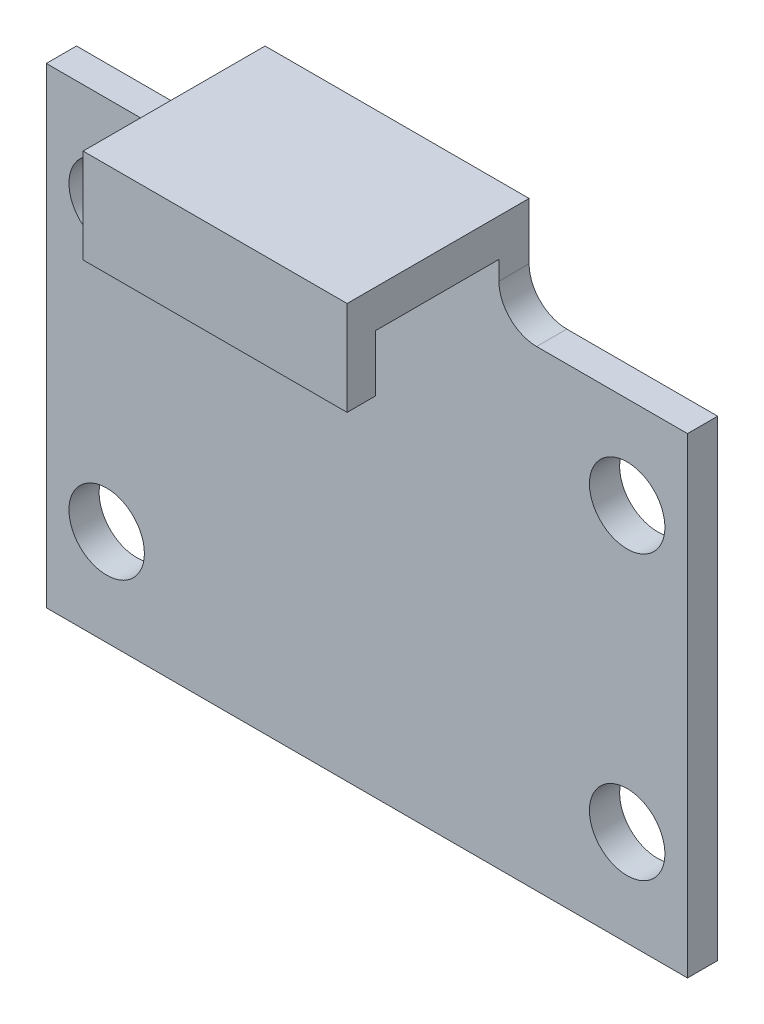
ISO-10303-21;
HEADER;
FILE_DESCRIPTION(('STEP AP214'),'2;1');
FILE_NAME('part.step','',(''),(''),'','','');
FILE_SCHEMA(('AUTOMOTIVE_DESIGN { 1 0 10303 214 1 1 1 1 }'));
ENDSEC;
DATA;
#1=APPLICATION_CONTEXT('core data for automotive mechanical design processes');
#2=APPLICATION_PROTOCOL_DEFINITION('international standard','automotive_design',2000,#1);
#3=PRODUCT_CONTEXT('',#1,'mechanical');
#4=PRODUCT('Part','Part','',(#3));
#5=PRODUCT_RELATED_PRODUCT_CATEGORY('part','',(#4));
#6=PRODUCT_DEFINITION_FORMATION('','',#4);
#7=PRODUCT_DEFINITION_CONTEXT('part definition',#1,'design');
#8=PRODUCT_DEFINITION('design','',#6,#7);
#9=PRODUCT_DEFINITION_SHAPE('','',#8);
#10=(LENGTH_UNIT() NAMED_UNIT(*) SI_UNIT(.MILLI.,.METRE.));
#11=(NAMED_UNIT(*) PLANE_ANGLE_UNIT() SI_UNIT($,.RADIAN.));
#12=(NAMED_UNIT(*) SI_UNIT($,.STERADIAN.) SOLID_ANGLE_UNIT());
#13=UNCERTAINTY_MEASURE_WITH_UNIT(LENGTH_MEASURE(1.E-05),#10,'distance_accuracy_value','');
#14=(GEOMETRIC_REPRESENTATION_CONTEXT(3) GLOBAL_UNCERTAINTY_ASSIGNED_CONTEXT((#13)) GLOBAL_UNIT_ASSIGNED_CONTEXT((#10,
#11,#12)) REPRESENTATION_CONTEXT('',''));
#15=CARTESIAN_POINT('',(0.,0.,0.));
#16=DIRECTION('',(0.,0.,1.));
#17=DIRECTION('',(1.,0.,0.));
#18=AXIS2_PLACEMENT_3D('',#15,#16,#17);
#19=CARTESIAN_POINT('',(-21.59,25.4,2.032));
#20=DIRECTION('',(0.,-1.,0.));
#21=DIRECTION('',(0.,0.,-1.));
#22=AXIS2_PLACEMENT_3D('',#19,#20,#21);
#23=PLANE('',#22);
#24=DIRECTION('',(0.,0.,-1.));
#25=VECTOR('',#24,1.);
#26=CARTESIAN_POINT('',(-8.89000000000001,25.4,0.));
#27=LINE('',#26,#25);
#28=CARTESIAN_POINT('',(-8.89000000000001,25.4,12.2555));
#29=VERTEX_POINT('',#28);
#30=CARTESIAN_POINT('',(-8.89000000000001,25.4,0.));
#31=VERTEX_POINT('',#30);
#32=EDGE_CURVE('E203',#29,#31,#27,.T.);
#33=ORIENTED_EDGE('',*,*,#32,.F.);
#34=DIRECTION('',(-1.,0.,0.));
#35=VECTOR('',#34,1.);
#36=CARTESIAN_POINT('',(-21.59,25.4,12.2555));
#37=LINE('',#36,#35);
#38=CARTESIAN_POINT('',(8.88999999999998,25.4,12.2555));
#39=VERTEX_POINT('',#38);
#40=EDGE_CURVE('E245',#39,#29,#37,.T.);
#41=ORIENTED_EDGE('',*,*,#40,.F.);
#42=DIRECTION('',(0.,0.,1.));
#43=VECTOR('',#42,1.);
#44=CARTESIAN_POINT('',(8.88999999999998,25.4,0.));
#45=LINE('',#44,#43);
#46=CARTESIAN_POINT('',(8.88999999999998,25.4,0.));
#47=VERTEX_POINT('',#46);
#48=EDGE_CURVE('E220',#47,#39,#45,.T.);
#49=ORIENTED_EDGE('',*,*,#48,.F.);
#50=DIRECTION('',(-1.,0.,0.));
#51=VECTOR('',#50,1.);
#52=CARTESIAN_POINT('',(-21.59,25.4,0.));
#53=LINE('',#52,#51);
#54=EDGE_CURVE('E164',#47,#31,#53,.T.);
#55=ORIENTED_EDGE('',*,*,#54,.T.);
#56=EDGE_LOOP('',(#33,#41,#49,#55));
#57=FACE_BOUND('',#56,.T.);
#58=ADVANCED_FACE('F37',(#57),#23,.F.);
#59=CARTESIAN_POINT('',(-21.59,22.86,10.3505));
#60=DIRECTION('',(0.,1.,0.));
#61=DIRECTION('',(0.,0.,1.));
#62=AXIS2_PLACEMENT_3D('',#59,#60,#61);
#63=PLANE('',#62);
#64=DIRECTION('',(0.,0.,1.));
#65=VECTOR('',#64,1.);
#66=CARTESIAN_POINT('',(-8.89000000000001,22.86,10.3505));
#67=LINE('',#66,#65);
#68=CARTESIAN_POINT('',(-8.89000000000001,22.86,2.032));
#69=VERTEX_POINT('',#68);
#70=CARTESIAN_POINT('',(-8.89000000000001,22.86,10.3505));
#71=VERTEX_POINT('',#70);
#72=EDGE_CURVE('E215',#69,#71,#67,.T.);
#73=ORIENTED_EDGE('',*,*,#72,.F.);
#74=DIRECTION('',(1.,0.,0.));
#75=VECTOR('',#74,1.);
#76=CARTESIAN_POINT('',(-21.59,22.86,2.032));
#77=LINE('',#76,#75);
#78=CARTESIAN_POINT('',(8.88999999999998,22.86,2.032));
#79=VERTEX_POINT('',#78);
#80=EDGE_CURVE('E248',#69,#79,#77,.T.);
#81=ORIENTED_EDGE('',*,*,#80,.T.);
#82=DIRECTION('',(0.,0.,1.));
#83=VECTOR('',#82,1.);
#84=CARTESIAN_POINT('',(8.88999999999998,22.86,10.3505));
#85=LINE('',#84,#83);
#86=CARTESIAN_POINT('',(8.88999999999998,22.86,10.3505));
#87=VERTEX_POINT('',#86);
#88=EDGE_CURVE('E234',#79,#87,#85,.T.);
#89=ORIENTED_EDGE('',*,*,#88,.T.);
#90=DIRECTION('',(1.,0.,0.));
#91=VECTOR('',#90,1.);
#92=CARTESIAN_POINT('',(-21.59,22.86,10.3505));
#93=LINE('',#92,#91);
#94=EDGE_CURVE('E250',#71,#87,#93,.T.);
#95=ORIENTED_EDGE('',*,*,#94,.F.);
#96=EDGE_LOOP('',(#73,#81,#89,#95));
#97=FACE_BOUND('',#96,.T.);
#98=ADVANCED_FACE('F291',(#97),#63,.F.);
#99=CARTESIAN_POINT('',(0.,0.,10.3505));
#100=DIRECTION('',(0.,0.,1.));
#101=DIRECTION('',(1.,0.,0.));
#102=AXIS2_PLACEMENT_3D('',#99,#100,#101);
#103=PLANE('',#102);
#104=DIRECTION('',(0.,-1.,0.));
#105=VECTOR('',#104,1.);
#106=CARTESIAN_POINT('',(-8.89000000000001,0.,10.3505));
#107=LINE('',#106,#105);
#108=CARTESIAN_POINT('',(-8.89000000000001,19.05,10.3505));
#109=VERTEX_POINT('',#108);
#110=EDGE_CURVE('E323',#71,#109,#107,.T.);
#111=ORIENTED_EDGE('',*,*,#110,.F.);
#112=ORIENTED_EDGE('',*,*,#94,.T.);
#113=DIRECTION('',(0.,-1.,0.));
#114=VECTOR('',#113,1.);
#115=CARTESIAN_POINT('',(8.88999999999998,0.,10.3505));
#116=LINE('',#115,#114);
#117=CARTESIAN_POINT('',(8.88999999999998,19.05,10.3505));
#118=VERTEX_POINT('',#117);
#119=EDGE_CURVE('E231',#87,#118,#116,.T.);
#120=ORIENTED_EDGE('',*,*,#119,.T.);
#121=DIRECTION('',(1.,0.,0.));
#122=VECTOR('',#121,1.);
#123=CARTESIAN_POINT('',(-21.59,19.05,10.3505));
#124=LINE('',#123,#122);
#125=EDGE_CURVE('E242',#109,#118,#124,.T.);
#126=ORIENTED_EDGE('',*,*,#125,.F.);
#127=EDGE_LOOP('',(#111,#112,#120,#126));
#128=FACE_BOUND('',#127,.T.);
#129=ADVANCED_FACE('F297',(#128),#103,.F.);
#130=CARTESIAN_POINT('',(-21.59,19.05,12.2555));
#131=DIRECTION('',(0.,1.,0.));
#132=DIRECTION('',(0.,0.,1.));
#133=AXIS2_PLACEMENT_3D('',#130,#131,#132);
#134=PLANE('',#133);
#135=DIRECTION('',(0.,0.,1.));
#136=VECTOR('',#135,1.);
#137=CARTESIAN_POINT('',(-8.89000000000001,19.05,0.));
#138=LINE('',#137,#136);
#139=CARTESIAN_POINT('',(-8.89000000000001,19.05,12.2555));
#140=VERTEX_POINT('',#139);
#141=EDGE_CURVE('E204',#109,#140,#138,.T.);
#142=ORIENTED_EDGE('',*,*,#141,.F.);
#143=ORIENTED_EDGE('',*,*,#125,.T.);
#144=DIRECTION('',(0.,0.,-1.));
#145=VECTOR('',#144,1.);
#146=CARTESIAN_POINT('',(8.88999999999998,19.05,0.));
#147=LINE('',#146,#145);
#148=CARTESIAN_POINT('',(8.88999999999998,19.05,12.2555));
#149=VERTEX_POINT('',#148);
#150=EDGE_CURVE('E225',#149,#118,#147,.T.);
#151=ORIENTED_EDGE('',*,*,#150,.F.);
#152=DIRECTION('',(1.,0.,0.));
#153=VECTOR('',#152,1.);
#154=CARTESIAN_POINT('',(-21.59,19.05,12.2555));
#155=LINE('',#154,#153);
#156=EDGE_CURVE('E243',#140,#149,#155,.T.);
#157=ORIENTED_EDGE('',*,*,#156,.F.);
#158=EDGE_LOOP('',(#142,#143,#151,#157));
#159=FACE_BOUND('',#158,.T.);
#160=ADVANCED_FACE('F350',(#159),#134,.F.);
#161=CARTESIAN_POINT('',(0.,0.,12.2555));
#162=DIRECTION('',(0.,0.,1.));
#163=DIRECTION('',(1.,0.,0.));
#164=AXIS2_PLACEMENT_3D('',#161,#162,#163);
#165=PLANE('',#164);
#166=ORIENTED_EDGE('',*,*,#40,.T.);
#167=DIRECTION('',(0.,1.,0.));
#168=VECTOR('',#167,1.);
#169=CARTESIAN_POINT('',(-8.89000000000001,25.4,12.2555));
#170=LINE('',#169,#168);
#171=EDGE_CURVE('E329',#140,#29,#170,.T.);
#172=ORIENTED_EDGE('',*,*,#171,.F.);
#173=ORIENTED_EDGE('',*,*,#156,.T.);
#174=DIRECTION('',(0.,-1.,0.));
#175=VECTOR('',#174,1.);
#176=CARTESIAN_POINT('',(8.88999999999998,25.4,12.2555));
#177=LINE('',#176,#175);
#178=EDGE_CURVE('E222',#39,#149,#177,.T.);
#179=ORIENTED_EDGE('',*,*,#178,.F.);
#180=EDGE_LOOP('',(#166,#172,#173,#179));
#181=FACE_BOUND('',#180,.T.);
#182=ADVANCED_FACE('F302',(#181),#165,.T.);
#183=CARTESIAN_POINT('',(21.59,25.4,2.032));
#184=DIRECTION('',(-1.,0.,0.));
#185=DIRECTION('',(0.,-1.,0.));
#186=AXIS2_PLACEMENT_3D('',#183,#184,#185);
#187=PLANE('',#186);
#188=DIRECTION('',(0.,1.,0.));
#189=VECTOR('',#188,1.);
#190=CARTESIAN_POINT('',(21.59,25.4,2.032));
#191=LINE('',#190,#189);
#192=CARTESIAN_POINT('',(21.59,-12.7,2.032));
#193=VERTEX_POINT('',#192);
#194=CARTESIAN_POINT('',(21.59,19.05,2.032));
#195=VERTEX_POINT('',#194);
#196=EDGE_CURVE('E149',#193,#195,#191,.T.);
#197=ORIENTED_EDGE('',*,*,#196,.F.);
#198=DIRECTION('',(0.,0.,1.));
#199=VECTOR('',#198,1.);
#200=CARTESIAN_POINT('',(21.59,-12.7,-10.668));
#201=LINE('',#200,#199);
#202=CARTESIAN_POINT('',(21.59,-12.7,0.));
#203=VERTEX_POINT('',#202);
#204=EDGE_CURVE('E136',#203,#193,#201,.T.);
#205=ORIENTED_EDGE('',*,*,#204,.F.);
#206=DIRECTION('',(0.,1.,0.));
#207=VECTOR('',#206,1.);
#208=CARTESIAN_POINT('',(21.59,25.4,0.));
#209=LINE('',#208,#207);
#210=CARTESIAN_POINT('',(21.59,19.05,0.));
#211=VERTEX_POINT('',#210);
#212=EDGE_CURVE('E170',#203,#211,#209,.T.);
#213=ORIENTED_EDGE('',*,*,#212,.T.);
#214=DIRECTION('',(0.,0.,-1.));
#215=VECTOR('',#214,1.);
#216=CARTESIAN_POINT('',(21.59,19.05,0.));
#217=LINE('',#216,#215);
#218=EDGE_CURVE('E158',#195,#211,#217,.T.);
#219=ORIENTED_EDGE('',*,*,#218,.F.);
#220=EDGE_LOOP('',(#197,#205,#213,#219));
#221=FACE_BOUND('',#220,.T.);
#222=ADVANCED_FACE('F156',(#221),#187,.F.);
#223=CARTESIAN_POINT('',(-21.59,25.4,2.032));
#224=DIRECTION('',(1.,0.,0.));
#225=DIRECTION('',(0.,1.,0.));
#226=AXIS2_PLACEMENT_3D('',#223,#224,#225);
#227=PLANE('',#226);
#228=DIRECTION('',(0.,-1.,0.));
#229=VECTOR('',#228,1.);
#230=CARTESIAN_POINT('',(-21.59,25.4,0.));
#231=LINE('',#230,#229);
#232=CARTESIAN_POINT('',(-21.59,19.05,0.));
#233=VERTEX_POINT('',#232);
#234=CARTESIAN_POINT('',(-21.59,-12.7,0.));
#235=VERTEX_POINT('',#234);
#236=EDGE_CURVE('E159',#233,#235,#231,.T.);
#237=ORIENTED_EDGE('',*,*,#236,.T.);
#238=DIRECTION('',(0.,0.,1.));
#239=VECTOR('',#238,1.);
#240=CARTESIAN_POINT('',(-21.59,-12.7,-10.668));
#241=LINE('',#240,#239);
#242=CARTESIAN_POINT('',(-21.59,-12.7,2.032));
#243=VERTEX_POINT('',#242);
#244=EDGE_CURVE('E52',#235,#243,#241,.T.);
#245=ORIENTED_EDGE('',*,*,#244,.T.);
#246=DIRECTION('',(0.,-1.,0.));
#247=VECTOR('',#246,1.);
#248=CARTESIAN_POINT('',(-21.59,25.4,2.032));
#249=LINE('',#248,#247);
#250=CARTESIAN_POINT('',(-21.59,19.05,2.032));
#251=VERTEX_POINT('',#250);
#252=EDGE_CURVE('E153',#251,#243,#249,.T.);
#253=ORIENTED_EDGE('',*,*,#252,.F.);
#254=DIRECTION('',(0.,0.,1.));
#255=VECTOR('',#254,1.);
#256=CARTESIAN_POINT('',(-21.59,19.05,0.));
#257=LINE('',#256,#255);
#258=EDGE_CURVE('E205',#233,#251,#257,.T.);
#259=ORIENTED_EDGE('',*,*,#258,.F.);
#260=EDGE_LOOP('',(#237,#245,#253,#259));
#261=FACE_BOUND('',#260,.T.);
#262=ADVANCED_FACE('F279',(#261),#227,.F.);
#263=CARTESIAN_POINT('',(0.,0.,2.032));
#264=DIRECTION('',(0.,0.,1.));
#265=DIRECTION('',(1.,0.,0.));
#266=AXIS2_PLACEMENT_3D('',#263,#264,#265);
#267=PLANE('',#266);
#268=DIRECTION('',(-1.,0.,0.));
#269=VECTOR('',#268,1.);
#270=CARTESIAN_POINT('',(-21.59,-12.7,2.032));
#271=LINE('',#270,#269);
#272=EDGE_CURVE('E139',#193,#243,#271,.T.);
#273=ORIENTED_EDGE('',*,*,#272,.F.);
#274=ORIENTED_EDGE('',*,*,#196,.T.);
#275=DIRECTION('',(1.,0.,0.));
#276=VECTOR('',#275,1.);
#277=CARTESIAN_POINT('',(0.,19.05,2.032));
#278=LINE('',#277,#276);
#279=CARTESIAN_POINT('',(11.43,19.05,2.032));
#280=VERTEX_POINT('',#279);
#281=EDGE_CURVE('E240',#280,#195,#278,.T.);
#282=ORIENTED_EDGE('',*,*,#281,.F.);
#283=CARTESIAN_POINT('',(11.43,21.59,2.032));
#284=DIRECTION('',(0.,0.,1.));
#285=DIRECTION('',(1.,0.,0.));
#286=AXIS2_PLACEMENT_3D('',#283,#284,#285);
#287=CIRCLE('',#286,2.54);
#288=CARTESIAN_POINT('',(8.88999999999998,21.59,2.032));
#289=VERTEX_POINT('',#288);
#290=EDGE_CURVE('E185',#280,#289,#287,.F.);
#291=ORIENTED_EDGE('',*,*,#290,.T.);
#292=DIRECTION('',(0.,-1.,0.));
#293=VECTOR('',#292,1.);
#294=CARTESIAN_POINT('',(8.88999999999998,0.,2.032));
#295=LINE('',#294,#293);
#296=EDGE_CURVE('E237',#79,#289,#295,.T.);
#297=ORIENTED_EDGE('',*,*,#296,.F.);
#298=ORIENTED_EDGE('',*,*,#80,.F.);
#299=DIRECTION('',(0.,-1.,0.));
#300=VECTOR('',#299,1.);
#301=CARTESIAN_POINT('',(-8.89000000000001,0.,2.032));
#302=LINE('',#301,#300);
#303=CARTESIAN_POINT('',(-8.89000000000001,21.59,2.032));
#304=VERTEX_POINT('',#303);
#305=EDGE_CURVE('E209',#69,#304,#302,.T.);
#306=ORIENTED_EDGE('',*,*,#305,.T.);
#307=CARTESIAN_POINT('',(-11.43,21.59,2.032));
#308=DIRECTION('',(0.,0.,1.));
#309=DIRECTION('',(1.,0.,0.));
#310=AXIS2_PLACEMENT_3D('',#307,#308,#309);
#311=CIRCLE('',#310,2.54);
#312=CARTESIAN_POINT('',(-11.43,19.05,2.032));
#313=VERTEX_POINT('',#312);
#314=EDGE_CURVE('E187',#304,#313,#311,.F.);
#315=ORIENTED_EDGE('',*,*,#314,.T.);
#316=DIRECTION('',(1.,0.,0.));
#317=VECTOR('',#316,1.);
#318=CARTESIAN_POINT('',(0.,19.05,2.032));
#319=LINE('',#318,#317);
#320=EDGE_CURVE('E207',#251,#313,#319,.T.);
#321=ORIENTED_EDGE('',*,*,#320,.F.);
#322=ORIENTED_EDGE('',*,*,#252,.T.);
#323=EDGE_LOOP('',(#273,#274,#282,#291,#297,#298,#306,#315,#321,#322));
#324=FACE_BOUND('',#323,.T.);
#325=CARTESIAN_POINT('',(17.526,12.827,2.032));
#326=DIRECTION('',(0.,0.,1.));
#327=DIRECTION('',(-1.,0.,0.));
#328=AXIS2_PLACEMENT_3D('',#325,#326,#327);
#329=CIRCLE('',#328,2.54);
#330=CARTESIAN_POINT('',(14.986,12.827,2.032));
#331=VERTEX_POINT('',#330);
#332=EDGE_CURVE('E266',#331,#331,#329,.T.);
#333=ORIENTED_EDGE('',*,*,#332,.F.);
#334=EDGE_LOOP('',(#333));
#335=FACE_BOUND('',#334,.T.);
#336=CARTESIAN_POINT('',(17.526,-6.22299999999999,2.032));
#337=DIRECTION('',(0.,0.,1.));
#338=DIRECTION('',(-1.,0.,0.));
#339=AXIS2_PLACEMENT_3D('',#336,#337,#338);
#340=CIRCLE('',#339,2.54);
#341=CARTESIAN_POINT('',(14.986,-6.22299999999999,2.032));
#342=VERTEX_POINT('',#341);
#343=EDGE_CURVE('E260',#342,#342,#340,.T.);
#344=ORIENTED_EDGE('',*,*,#343,.F.);
#345=EDGE_LOOP('',(#344));
#346=FACE_BOUND('',#345,.T.);
#347=CARTESIAN_POINT('',(-17.526,-6.223,2.032));
#348=DIRECTION('',(0.,0.,1.));
#349=DIRECTION('',(1.,0.,0.));
#350=AXIS2_PLACEMENT_3D('',#347,#348,#349);
#351=CIRCLE('',#350,2.54);
#352=CARTESIAN_POINT('',(-14.986,-6.223,2.032));
#353=VERTEX_POINT('',#352);
#354=EDGE_CURVE('E254',#353,#353,#351,.T.);
#355=ORIENTED_EDGE('',*,*,#354,.F.);
#356=EDGE_LOOP('',(#355));
#357=FACE_BOUND('',#356,.T.);
#358=CARTESIAN_POINT('',(-17.526,12.827,2.032));
#359=DIRECTION('',(0.,0.,1.));
#360=DIRECTION('',(1.,0.,0.));
#361=AXIS2_PLACEMENT_3D('',#358,#359,#360);
#362=CIRCLE('',#361,2.54);
#363=CARTESIAN_POINT('',(-14.986,12.827,2.032));
#364=VERTEX_POINT('',#363);
#365=EDGE_CURVE('E167',#364,#364,#362,.T.);
#366=ORIENTED_EDGE('',*,*,#365,.F.);
#367=EDGE_LOOP('',(#366));
#368=FACE_BOUND('',#367,.T.);
#369=ADVANCED_FACE('F146',(#324,#335,#346,#357,#368),#267,.T.);
#370=CARTESIAN_POINT('',(0.,0.,0.));
#371=DIRECTION('',(0.,0.,1.));
#372=DIRECTION('',(1.,0.,0.));
#373=AXIS2_PLACEMENT_3D('',#370,#371,#372);
#374=PLANE('',#373);
#375=CARTESIAN_POINT('',(17.526,12.827,0.));
#376=DIRECTION('',(0.,0.,1.));
#377=DIRECTION('',(-1.,0.,0.));
#378=AXIS2_PLACEMENT_3D('',#375,#376,#377);
#379=CIRCLE('',#378,2.54);
#380=CARTESIAN_POINT('',(14.986,12.827,0.));
#381=VERTEX_POINT('',#380);
#382=EDGE_CURVE('E252',#381,#381,#379,.T.);
#383=ORIENTED_EDGE('',*,*,#382,.T.);
#384=EDGE_LOOP('',(#383));
#385=FACE_BOUND('',#384,.T.);
#386=CARTESIAN_POINT('',(17.526,-6.22299999999999,0.));
#387=DIRECTION('',(0.,0.,1.));
#388=DIRECTION('',(-1.,0.,0.));
#389=AXIS2_PLACEMENT_3D('',#386,#387,#388);
#390=CIRCLE('',#389,2.54);
#391=CARTESIAN_POINT('',(14.986,-6.22299999999999,0.));
#392=VERTEX_POINT('',#391);
#393=EDGE_CURVE('E263',#392,#392,#390,.T.);
#394=ORIENTED_EDGE('',*,*,#393,.T.);
#395=EDGE_LOOP('',(#394));
#396=FACE_BOUND('',#395,.T.);
#397=CARTESIAN_POINT('',(-17.526,-6.223,0.));
#398=DIRECTION('',(0.,0.,1.));
#399=DIRECTION('',(1.,0.,0.));
#400=AXIS2_PLACEMENT_3D('',#397,#398,#399);
#401=CIRCLE('',#400,2.54);
#402=CARTESIAN_POINT('',(-14.986,-6.223,0.));
#403=VERTEX_POINT('',#402);
#404=EDGE_CURVE('E257',#403,#403,#401,.T.);
#405=ORIENTED_EDGE('',*,*,#404,.T.);
#406=EDGE_LOOP('',(#405));
#407=FACE_BOUND('',#406,.T.);
#408=CARTESIAN_POINT('',(-17.526,12.827,0.));
#409=DIRECTION('',(0.,0.,1.));
#410=DIRECTION('',(1.,0.,0.));
#411=AXIS2_PLACEMENT_3D('',#408,#409,#410);
#412=CIRCLE('',#411,2.54);
#413=CARTESIAN_POINT('',(-14.986,12.827,0.));
#414=VERTEX_POINT('',#413);
#415=EDGE_CURVE('E172',#414,#414,#412,.T.);
#416=ORIENTED_EDGE('',*,*,#415,.T.);
#417=EDGE_LOOP('',(#416));
#418=FACE_BOUND('',#417,.T.);
#419=ORIENTED_EDGE('',*,*,#212,.F.);
#420=DIRECTION('',(-1.,0.,0.));
#421=VECTOR('',#420,1.);
#422=CARTESIAN_POINT('',(0.,-12.7,0.));
#423=LINE('',#422,#421);
#424=EDGE_CURVE('E11',#203,#235,#423,.T.);
#425=ORIENTED_EDGE('',*,*,#424,.T.);
#426=ORIENTED_EDGE('',*,*,#236,.F.);
#427=DIRECTION('',(-1.,0.,0.));
#428=VECTOR('',#427,1.);
#429=CARTESIAN_POINT('',(-8.89000000000001,19.05,0.));
#430=LINE('',#429,#428);
#431=CARTESIAN_POINT('',(-11.43,19.05,0.));
#432=VERTEX_POINT('',#431);
#433=EDGE_CURVE('E196',#432,#233,#430,.T.);
#434=ORIENTED_EDGE('',*,*,#433,.F.);
#435=CARTESIAN_POINT('',(-11.43,21.59,0.));
#436=DIRECTION('',(0.,0.,1.));
#437=DIRECTION('',(1.,0.,0.));
#438=AXIS2_PLACEMENT_3D('',#435,#436,#437);
#439=CIRCLE('',#438,2.54);
#440=CARTESIAN_POINT('',(-8.89000000000001,21.59,0.));
#441=VERTEX_POINT('',#440);
#442=EDGE_CURVE('E45',#432,#441,#439,.T.);
#443=ORIENTED_EDGE('',*,*,#442,.T.);
#444=DIRECTION('',(0.,-1.,0.));
#445=VECTOR('',#444,1.);
#446=CARTESIAN_POINT('',(-8.89000000000001,25.4,0.));
#447=LINE('',#446,#445);
#448=EDGE_CURVE('E194',#31,#441,#447,.T.);
#449=ORIENTED_EDGE('',*,*,#448,.F.);
#450=ORIENTED_EDGE('',*,*,#54,.F.);
#451=DIRECTION('',(0.,1.,0.));
#452=VECTOR('',#451,1.);
#453=CARTESIAN_POINT('',(8.88999999999998,25.4,0.));
#454=LINE('',#453,#452);
#455=CARTESIAN_POINT('',(8.88999999999998,21.59,0.));
#456=VERTEX_POINT('',#455);
#457=EDGE_CURVE('E213',#456,#47,#454,.T.);
#458=ORIENTED_EDGE('',*,*,#457,.F.);
#459=CARTESIAN_POINT('',(11.43,21.59,0.));
#460=DIRECTION('',(0.,0.,1.));
#461=DIRECTION('',(1.,0.,0.));
#462=AXIS2_PLACEMENT_3D('',#459,#460,#461);
#463=CIRCLE('',#462,2.54);
#464=CARTESIAN_POINT('',(11.43,19.05,0.));
#465=VERTEX_POINT('',#464);
#466=EDGE_CURVE('E183',#456,#465,#463,.T.);
#467=ORIENTED_EDGE('',*,*,#466,.T.);
#468=DIRECTION('',(1.,0.,0.));
#469=VECTOR('',#468,1.);
#470=CARTESIAN_POINT('',(8.88999999999998,19.05,0.));
#471=LINE('',#470,#469);
#472=EDGE_CURVE('E227',#465,#211,#471,.T.);
#473=ORIENTED_EDGE('',*,*,#472,.T.);
#474=EDGE_LOOP('',(#419,#425,#426,#434,#443,#449,#450,#458,#467,#473));
#475=FACE_BOUND('',#474,.T.);
#476=ADVANCED_FACE('F192',(#385,#396,#407,#418,#475),#374,.F.);
#477=CARTESIAN_POINT('',(-17.526,12.827,0.));
#478=DIRECTION('',(0.,0.,1.));
#479=DIRECTION('',(1.,0.,0.));
#480=AXIS2_PLACEMENT_3D('',#477,#478,#479);
#481=CYLINDRICAL_SURFACE('',#480,2.54);
#482=ORIENTED_EDGE('',*,*,#415,.F.);
#483=EDGE_LOOP('',(#482));
#484=FACE_BOUND('',#483,.T.);
#485=ORIENTED_EDGE('',*,*,#365,.T.);
#486=EDGE_LOOP('',(#485));
#487=FACE_BOUND('',#486,.T.);
#488=ADVANCED_FACE('F276',(#484,#487),#481,.F.);
#489=CARTESIAN_POINT('',(-17.526,-6.223,0.));
#490=DIRECTION('',(0.,0.,1.));
#491=DIRECTION('',(1.,0.,0.));
#492=AXIS2_PLACEMENT_3D('',#489,#490,#491);
#493=CYLINDRICAL_SURFACE('',#492,2.54);
#494=ORIENTED_EDGE('',*,*,#404,.F.);
#495=EDGE_LOOP('',(#494));
#496=FACE_BOUND('',#495,.T.);
#497=ORIENTED_EDGE('',*,*,#354,.T.);
#498=EDGE_LOOP('',(#497));
#499=FACE_BOUND('',#498,.T.);
#500=ADVANCED_FACE('F358',(#496,#499),#493,.F.);
#501=CARTESIAN_POINT('',(17.526,-6.22299999999999,0.));
#502=DIRECTION('',(0.,0.,1.));
#503=DIRECTION('',(1.,0.,0.));
#504=AXIS2_PLACEMENT_3D('',#501,#502,#503);
#505=CYLINDRICAL_SURFACE('',#504,2.54);
#506=ORIENTED_EDGE('',*,*,#393,.F.);
#507=EDGE_LOOP('',(#506));
#508=FACE_BOUND('',#507,.T.);
#509=ORIENTED_EDGE('',*,*,#343,.T.);
#510=EDGE_LOOP('',(#509));
#511=FACE_BOUND('',#510,.T.);
#512=ADVANCED_FACE('F343',(#508,#511),#505,.F.);
#513=CARTESIAN_POINT('',(17.526,12.827,0.));
#514=DIRECTION('',(0.,0.,1.));
#515=DIRECTION('',(1.,0.,0.));
#516=AXIS2_PLACEMENT_3D('',#513,#514,#515);
#517=CYLINDRICAL_SURFACE('',#516,2.54);
#518=ORIENTED_EDGE('',*,*,#382,.F.);
#519=EDGE_LOOP('',(#518));
#520=FACE_BOUND('',#519,.T.);
#521=ORIENTED_EDGE('',*,*,#332,.T.);
#522=EDGE_LOOP('',(#521));
#523=FACE_BOUND('',#522,.T.);
#524=ADVANCED_FACE('F336',(#520,#523),#517,.F.);
#525=CARTESIAN_POINT('',(8.88999999999998,19.05,0.));
#526=DIRECTION('',(0.,-1.,0.));
#527=DIRECTION('',(1.,0.,0.));
#528=AXIS2_PLACEMENT_3D('',#525,#526,#527);
#529=PLANE('',#528);
#530=ORIENTED_EDGE('',*,*,#472,.F.);
#531=DIRECTION('',(0.,0.,-1.));
#532=VECTOR('',#531,1.);
#533=CARTESIAN_POINT('',(11.43,19.05,2.032));
#534=LINE('',#533,#532);
#535=EDGE_CURVE('E177',#465,#280,#534,.F.);
#536=ORIENTED_EDGE('',*,*,#535,.T.);
#537=ORIENTED_EDGE('',*,*,#281,.T.);
#538=ORIENTED_EDGE('',*,*,#218,.T.);
#539=EDGE_LOOP('',(#530,#536,#537,#538));
#540=FACE_BOUND('',#539,.T.);
#541=ADVANCED_FACE('F334',(#540),#529,.F.);
#542=CARTESIAN_POINT('',(8.88999999999998,0.,0.));
#543=DIRECTION('',(-1.,0.,0.));
#544=DIRECTION('',(0.,0.,1.));
#545=AXIS2_PLACEMENT_3D('',#542,#543,#544);
#546=PLANE('',#545);
#547=ORIENTED_EDGE('',*,*,#296,.T.);
#548=DIRECTION('',(0.,0.,-1.));
#549=VECTOR('',#548,1.);
#550=CARTESIAN_POINT('',(8.88999999999998,21.59,0.));
#551=LINE('',#550,#549);
#552=EDGE_CURVE('E161',#289,#456,#551,.T.);
#553=ORIENTED_EDGE('',*,*,#552,.T.);
#554=ORIENTED_EDGE('',*,*,#457,.T.);
#555=ORIENTED_EDGE('',*,*,#48,.T.);
#556=ORIENTED_EDGE('',*,*,#178,.T.);
#557=ORIENTED_EDGE('',*,*,#150,.T.);
#558=ORIENTED_EDGE('',*,*,#119,.F.);
#559=ORIENTED_EDGE('',*,*,#88,.F.);
#560=EDGE_LOOP('',(#547,#553,#554,#555,#556,#557,#558,#559));
#561=FACE_BOUND('',#560,.T.);
#562=ADVANCED_FACE('F317',(#561),#546,.F.);
#563=CARTESIAN_POINT('',(-8.89000000000001,19.05,0.));
#564=DIRECTION('',(0.,-1.,0.));
#565=DIRECTION('',(1.,0.,0.));
#566=AXIS2_PLACEMENT_3D('',#563,#564,#565);
#567=PLANE('',#566);
#568=ORIENTED_EDGE('',*,*,#320,.T.);
#569=DIRECTION('',(0.,0.,1.));
#570=VECTOR('',#569,1.);
#571=CARTESIAN_POINT('',(-11.43,19.05,0.));
#572=LINE('',#571,#570);
#573=EDGE_CURVE('E59',#313,#432,#572,.F.);
#574=ORIENTED_EDGE('',*,*,#573,.T.);
#575=ORIENTED_EDGE('',*,*,#433,.T.);
#576=ORIENTED_EDGE('',*,*,#258,.T.);
#577=EDGE_LOOP('',(#568,#574,#575,#576));
#578=FACE_BOUND('',#577,.T.);
#579=ADVANCED_FACE('F210',(#578),#567,.F.);
#580=CARTESIAN_POINT('',(-8.89000000000001,0.,0.));
#581=DIRECTION('',(-1.,0.,0.));
#582=DIRECTION('',(0.,0.,1.));
#583=AXIS2_PLACEMENT_3D('',#580,#581,#582);
#584=PLANE('',#583);
#585=ORIENTED_EDGE('',*,*,#448,.T.);
#586=DIRECTION('',(0.,0.,1.));
#587=VECTOR('',#586,1.);
#588=CARTESIAN_POINT('',(-8.89000000000001,21.59,0.));
#589=LINE('',#588,#587);
#590=EDGE_CURVE('E179',#441,#304,#589,.T.);
#591=ORIENTED_EDGE('',*,*,#590,.T.);
#592=ORIENTED_EDGE('',*,*,#305,.F.);
#593=ORIENTED_EDGE('',*,*,#72,.T.);
#594=ORIENTED_EDGE('',*,*,#110,.T.);
#595=ORIENTED_EDGE('',*,*,#141,.T.);
#596=ORIENTED_EDGE('',*,*,#171,.T.);
#597=ORIENTED_EDGE('',*,*,#32,.T.);
#598=EDGE_LOOP('',(#585,#591,#592,#593,#594,#595,#596,#597));
#599=FACE_BOUND('',#598,.T.);
#600=ADVANCED_FACE('F200',(#599),#584,.T.);
#601=CARTESIAN_POINT('',(11.43,21.59,0.));
#602=DIRECTION('',(0.,0.,1.));
#603=DIRECTION('',(1.,0.,0.));
#604=AXIS2_PLACEMENT_3D('',#601,#602,#603);
#605=CYLINDRICAL_SURFACE('',#604,2.54);
#606=ORIENTED_EDGE('',*,*,#290,.F.);
#607=ORIENTED_EDGE('',*,*,#535,.F.);
#608=ORIENTED_EDGE('',*,*,#466,.F.);
#609=ORIENTED_EDGE('',*,*,#552,.F.);
#610=EDGE_LOOP('',(#606,#607,#608,#609));
#611=FACE_BOUND('',#610,.T.);
#612=ADVANCED_FACE('F303',(#611),#605,.F.);
#613=CARTESIAN_POINT('',(-11.43,21.59,0.));
#614=DIRECTION('',(0.,0.,1.));
#615=DIRECTION('',(1.,0.,0.));
#616=AXIS2_PLACEMENT_3D('',#613,#614,#615);
#617=CYLINDRICAL_SURFACE('',#616,2.54);
#618=ORIENTED_EDGE('',*,*,#442,.F.);
#619=ORIENTED_EDGE('',*,*,#573,.F.);
#620=ORIENTED_EDGE('',*,*,#314,.F.);
#621=ORIENTED_EDGE('',*,*,#590,.F.);
#622=EDGE_LOOP('',(#618,#619,#620,#621));
#623=FACE_BOUND('',#622,.T.);
#624=ADVANCED_FACE('F39',(#623),#617,.F.);
#625=CARTESIAN_POINT('',(-21.59,-12.7,-10.668));
#626=DIRECTION('',(0.,1.,0.));
#627=DIRECTION('',(0.,0.,1.));
#628=AXIS2_PLACEMENT_3D('',#625,#626,#627);
#629=PLANE('',#628);
#630=ORIENTED_EDGE('',*,*,#204,.T.);
#631=ORIENTED_EDGE('',*,*,#272,.T.);
#632=ORIENTED_EDGE('',*,*,#244,.F.);
#633=ORIENTED_EDGE('',*,*,#424,.F.);
#634=EDGE_LOOP('',(#630,#631,#632,#633));
#635=FACE_BOUND('',#634,.T.);
#636=ADVANCED_FACE('F138',(#635),#629,.F.);
#637=CLOSED_SHELL('',(#58,#98,#129,#160,#182,#222,#262,#369,#476,#488,#500,#512,#524,#541,#562,
#579,#600,#612,#624,#636));
#638=MANIFOLD_SOLID_BREP('B2',#637);
#639=ADVANCED_BREP_SHAPE_REPRESENTATION('',(#18,#638),#14);
#640=SHAPE_DEFINITION_REPRESENTATION(#9,#639);
ENDSEC;
END-ISO-10303-21;
